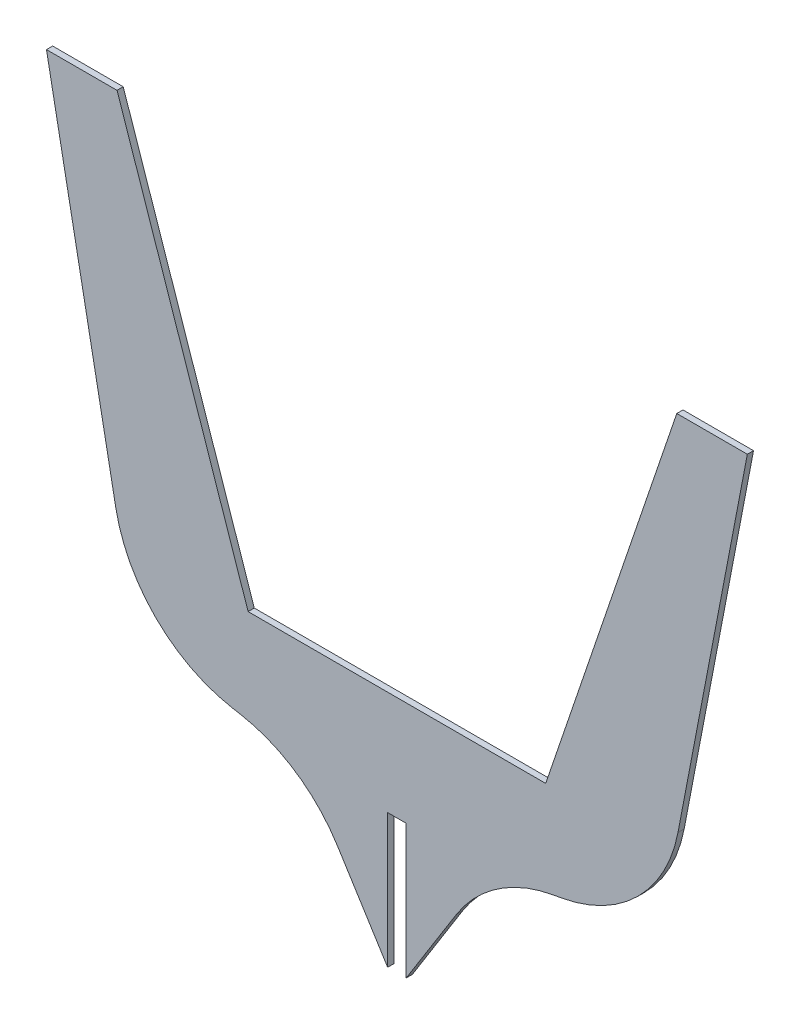
ISO-10303-21;
HEADER;
FILE_DESCRIPTION(('STEP AP214'),'2;1');
FILE_NAME('part.step','',(''),(''),'','','');
FILE_SCHEMA(('AUTOMOTIVE_DESIGN { 1 0 10303 214 1 1 1 1 }'));
ENDSEC;
DATA;
#1=APPLICATION_CONTEXT('core data for automotive mechanical design processes');
#2=APPLICATION_PROTOCOL_DEFINITION('international standard','automotive_design',2000,#1);
#3=PRODUCT_CONTEXT('',#1,'mechanical');
#4=PRODUCT('Part','Part','',(#3));
#5=PRODUCT_RELATED_PRODUCT_CATEGORY('part','',(#4));
#6=PRODUCT_DEFINITION_FORMATION('','',#4);
#7=PRODUCT_DEFINITION_CONTEXT('part definition',#1,'design');
#8=PRODUCT_DEFINITION('design','',#6,#7);
#9=PRODUCT_DEFINITION_SHAPE('','',#8);
#10=(LENGTH_UNIT() NAMED_UNIT(*) SI_UNIT(.MILLI.,.METRE.));
#11=(NAMED_UNIT(*) PLANE_ANGLE_UNIT() SI_UNIT($,.RADIAN.));
#12=(NAMED_UNIT(*) SI_UNIT($,.STERADIAN.) SOLID_ANGLE_UNIT());
#13=UNCERTAINTY_MEASURE_WITH_UNIT(LENGTH_MEASURE(1.E-05),#10,'distance_accuracy_value','');
#14=(GEOMETRIC_REPRESENTATION_CONTEXT(3) GLOBAL_UNCERTAINTY_ASSIGNED_CONTEXT((#13)) GLOBAL_UNIT_ASSIGNED_CONTEXT((#10,
#11,#12)) REPRESENTATION_CONTEXT('',''));
#15=CARTESIAN_POINT('',(0.,0.,0.));
#16=DIRECTION('',(0.,0.,1.));
#17=DIRECTION('',(1.,0.,0.));
#18=AXIS2_PLACEMENT_3D('',#15,#16,#17);
#19=CARTESIAN_POINT('',(-60.7194290074853,223.87379688582,3.));
#20=DIRECTION('',(-0.9468587418631,-0.321649689813976,0.));
#21=DIRECTION('',(0.321649689813976,-0.9468587418631,0.));
#22=AXIS2_PLACEMENT_3D('',#19,#20,#21);
#23=PLANE('',#22);
#24=DIRECTION('',(-0.321649689813976,0.9468587418631,0.));
#25=VECTOR('',#24,1.);
#26=CARTESIAN_POINT('',(-60.7194290074853,223.87379688582,0.));
#27=LINE('',#26,#25);
#28=CARTESIAN_POINT('',(2.8758954370924,36.6645726928973,0.));
#29=VERTEX_POINT('',#28);
#30=CARTESIAN_POINT('',(-60.7194290074853,223.87379688582,0.));
#31=VERTEX_POINT('',#30);
#32=EDGE_CURVE('E184',#29,#31,#27,.T.);
#33=ORIENTED_EDGE('',*,*,#32,.T.);
#34=DIRECTION('',(0.,0.,-1.));
#35=VECTOR('',#34,1.);
#36=CARTESIAN_POINT('',(-60.7194290074853,223.87379688582,3.));
#37=LINE('',#36,#35);
#38=CARTESIAN_POINT('',(-60.7194290074853,223.87379688582,3.));
#39=VERTEX_POINT('',#38);
#40=EDGE_CURVE('E165',#39,#31,#37,.T.);
#41=ORIENTED_EDGE('',*,*,#40,.F.);
#42=DIRECTION('',(-0.321649689813976,0.9468587418631,0.));
#43=VECTOR('',#42,1.);
#44=CARTESIAN_POINT('',(-60.7194290074853,223.87379688582,3.));
#45=LINE('',#44,#43);
#46=CARTESIAN_POINT('',(2.8758954370924,36.6645726928973,3.));
#47=VERTEX_POINT('',#46);
#48=EDGE_CURVE('E172',#47,#39,#45,.T.);
#49=ORIENTED_EDGE('',*,*,#48,.F.);
#50=DIRECTION('',(0.,0.,-1.));
#51=VECTOR('',#50,1.);
#52=CARTESIAN_POINT('',(2.8758954370924,36.6645726928973,3.));
#53=LINE('',#52,#51);
#54=EDGE_CURVE('E256',#47,#29,#53,.T.);
#55=ORIENTED_EDGE('',*,*,#54,.T.);
#56=EDGE_LOOP('',(#33,#41,#49,#55));
#57=FACE_BOUND('',#56,.T.);
#58=ADVANCED_FACE('F35',(#57),#23,.F.);
#59=CARTESIAN_POINT('',(-60.7194290074853,223.87379688582,3.));
#60=DIRECTION('',(0.,-1.,0.));
#61=DIRECTION('',(0.,0.,-1.));
#62=AXIS2_PLACEMENT_3D('',#59,#60,#61);
#63=PLANE('',#62);
#64=DIRECTION('',(-1.,0.,0.));
#65=VECTOR('',#64,1.);
#66=CARTESIAN_POINT('',(-60.7194290074853,223.87379688582,0.));
#67=LINE('',#66,#65);
#68=CARTESIAN_POINT('',(-94.9471708127322,223.87379688582,0.));
#69=VERTEX_POINT('',#68);
#70=EDGE_CURVE('E258',#31,#69,#67,.T.);
#71=ORIENTED_EDGE('',*,*,#70,.T.);
#72=DIRECTION('',(0.,0.,-1.));
#73=VECTOR('',#72,1.);
#74=CARTESIAN_POINT('',(-94.9471708127322,223.87379688582,3.));
#75=LINE('',#74,#73);
#76=CARTESIAN_POINT('',(-94.9471708127322,223.87379688582,3.));
#77=VERTEX_POINT('',#76);
#78=EDGE_CURVE('E168',#77,#69,#75,.T.);
#79=ORIENTED_EDGE('',*,*,#78,.F.);
#80=DIRECTION('',(-1.,0.,0.));
#81=VECTOR('',#80,1.);
#82=CARTESIAN_POINT('',(-60.7194290074853,223.87379688582,3.));
#83=LINE('',#82,#81);
#84=EDGE_CURVE('E161',#39,#77,#83,.T.);
#85=ORIENTED_EDGE('',*,*,#84,.F.);
#86=ORIENTED_EDGE('',*,*,#40,.T.);
#87=EDGE_LOOP('',(#71,#79,#85,#86));
#88=FACE_BOUND('',#87,.T.);
#89=ADVANCED_FACE('F163',(#88),#63,.F.);
#90=CARTESIAN_POINT('',(-94.9471708127322,223.87379688582,3.));
#91=DIRECTION('',(0.982161493286106,0.188039360523285,0.));
#92=DIRECTION('',(-0.188039360523285,0.982161493286106,0.));
#93=AXIS2_PLACEMENT_3D('',#90,#91,#92);
#94=PLANE('',#93);
#95=DIRECTION('',(0.188039360523285,-0.982161493286106,0.));
#96=VECTOR('',#95,1.);
#97=CARTESIAN_POINT('',(-94.9471708127322,223.87379688582,0.));
#98=LINE('',#97,#96);
#99=CARTESIAN_POINT('',(-61.2998496903465,48.1281281775532,0.));
#100=VERTEX_POINT('',#99);
#101=EDGE_CURVE('E260',#69,#100,#98,.T.);
#102=ORIENTED_EDGE('',*,*,#101,.T.);
#103=DIRECTION('',(0.,0.,-1.));
#104=VECTOR('',#103,1.);
#105=CARTESIAN_POINT('',(-61.2998496903465,48.1281281775532,3.));
#106=LINE('',#105,#104);
#107=CARTESIAN_POINT('',(-61.2998496903465,48.1281281775532,3.));
#108=VERTEX_POINT('',#107);
#109=EDGE_CURVE('E202',#100,#108,#106,.F.);
#110=ORIENTED_EDGE('',*,*,#109,.T.);
#111=DIRECTION('',(0.188039360523285,-0.982161493286106,0.));
#112=VECTOR('',#111,1.);
#113=CARTESIAN_POINT('',(-94.9471708127322,223.87379688582,3.));
#114=LINE('',#113,#112);
#115=EDGE_CURVE('E171',#77,#108,#114,.T.);
#116=ORIENTED_EDGE('',*,*,#115,.F.);
#117=ORIENTED_EDGE('',*,*,#78,.T.);
#118=EDGE_LOOP('',(#102,#110,#116,#117));
#119=FACE_BOUND('',#118,.T.);
#120=ADVANCED_FACE('F348',(#119),#94,.F.);
#121=CARTESIAN_POINT('',(-52.2777216144433,1.00402203834812,3.));
#122=DIRECTION('',(0.178903713021598,0.983866587229735,0.));
#123=DIRECTION('',(-0.983866587229735,0.178903713021598,0.));
#124=AXIS2_PLACEMENT_3D('',#121,#122,#123);
#125=PLANE('',#124);
#126=DIRECTION('',(0.983866587229735,-0.178903713021598,0.));
#127=VECTOR('',#126,1.);
#128=CARTESIAN_POINT('',(-52.2777216144433,1.00402203834812,0.));
#129=LINE('',#128,#127);
#130=CARTESIAN_POINT('',(-5.07180507183095,-7.57977769189828,0.));
#131=VERTEX_POINT('',#130);
#132=CARTESIAN_POINT('',(-0.564859123719376,-8.39930889152477,0.));
#133=VERTEX_POINT('',#132);
#134=EDGE_CURVE('E263',#131,#133,#129,.T.);
#135=ORIENTED_EDGE('',*,*,#134,.T.);
#136=DIRECTION('',(0.,0.,-1.));
#137=VECTOR('',#136,1.);
#138=CARTESIAN_POINT('',(-0.564859123719354,-8.39930889152478,3.));
#139=LINE('',#138,#137);
#140=CARTESIAN_POINT('',(-0.564859123719376,-8.39930889152477,3.));
#141=VERTEX_POINT('',#140);
#142=EDGE_CURVE('E196',#133,#141,#139,.F.);
#143=ORIENTED_EDGE('',*,*,#142,.T.);
#144=DIRECTION('',(0.983866587229735,-0.178903713021598,0.));
#145=VECTOR('',#144,1.);
#146=CARTESIAN_POINT('',(-52.2777216144433,1.00402203834812,3.));
#147=LINE('',#146,#145);
#148=CARTESIAN_POINT('',(-5.07180507183095,-7.57977769189828,3.));
#149=VERTEX_POINT('',#148);
#150=EDGE_CURVE('E322',#149,#141,#147,.T.);
#151=ORIENTED_EDGE('',*,*,#150,.F.);
#152=DIRECTION('',(0.,0.,-1.));
#153=VECTOR('',#152,1.);
#154=CARTESIAN_POINT('',(-5.07180507183092,-7.57977769189828,3.));
#155=LINE('',#154,#153);
#156=EDGE_CURVE('E188',#149,#131,#155,.T.);
#157=ORIENTED_EDGE('',*,*,#156,.T.);
#158=EDGE_LOOP('',(#135,#143,#151,#157));
#159=FACE_BOUND('',#158,.T.);
#160=ADVANCED_FACE('F333',(#159),#125,.F.);
#161=CARTESIAN_POINT('',(29.8298513324426,-13.9262031141802,3.));
#162=DIRECTION('',(0.847423709661977,0.530917184034133,0.));
#163=DIRECTION('',(-0.530917184034133,0.847423709661977,0.));
#164=AXIS2_PLACEMENT_3D('',#161,#162,#163);
#165=PLANE('',#164);
#166=DIRECTION('',(0.530917184034133,-0.847423709661977,0.));
#167=VECTOR('',#166,1.);
#168=CARTESIAN_POINT('',(29.8298513324426,-13.9262031141802,3.));
#169=LINE('',#168,#167);
#170=CARTESIAN_POINT('',(46.2315406411072,-40.1057671152169,3.));
#171=VERTEX_POINT('',#170);
#172=CARTESIAN_POINT('',(70.5528291872678,-78.9262031141802,3.));
#173=VERTEX_POINT('',#172);
#174=EDGE_CURVE('E320',#171,#173,#169,.T.);
#175=ORIENTED_EDGE('',*,*,#174,.F.);
#176=DIRECTION('',(0.,0.,-1.));
#177=VECTOR('',#176,1.);
#178=CARTESIAN_POINT('',(46.2315406411072,-40.1057671152169,0.));
#179=LINE('',#178,#177);
#180=CARTESIAN_POINT('',(46.2315406411072,-40.1057671152169,0.));
#181=VERTEX_POINT('',#180);
#182=EDGE_CURVE('E185',#171,#181,#179,.T.);
#183=ORIENTED_EDGE('',*,*,#182,.T.);
#184=DIRECTION('',(0.530917184034133,-0.847423709661977,0.));
#185=VECTOR('',#184,1.);
#186=CARTESIAN_POINT('',(29.8298513324426,-13.9262031141802,0.));
#187=LINE('',#186,#185);
#188=CARTESIAN_POINT('',(70.5528291872678,-78.9262031141802,0.));
#189=VERTEX_POINT('',#188);
#190=EDGE_CURVE('E266',#181,#189,#187,.T.);
#191=ORIENTED_EDGE('',*,*,#190,.T.);
#192=DIRECTION('',(0.,0.,-1.));
#193=VECTOR('',#192,1.);
#194=CARTESIAN_POINT('',(70.5528291872678,-78.9262031141802,3.));
#195=LINE('',#194,#193);
#196=EDGE_CURVE('E190',#173,#189,#195,.T.);
#197=ORIENTED_EDGE('',*,*,#196,.F.);
#198=EDGE_LOOP('',(#175,#183,#191,#197));
#199=FACE_BOUND('',#198,.T.);
#200=ADVANCED_FACE('F340',(#199),#165,.F.);
#201=CARTESIAN_POINT('',(70.5528291872678,-78.9262031141802,3.));
#202=DIRECTION('',(-1.,0.,0.));
#203=DIRECTION('',(0.,-1.,0.));
#204=AXIS2_PLACEMENT_3D('',#201,#202,#203);
#205=PLANE('',#204);
#206=DIRECTION('',(0.,1.,0.));
#207=VECTOR('',#206,1.);
#208=CARTESIAN_POINT('',(70.5528291872678,-78.9262031141802,0.));
#209=LINE('',#208,#207);
#210=CARTESIAN_POINT('',(70.5528291872678,-13.9262031141802,0.));
#211=VERTEX_POINT('',#210);
#212=EDGE_CURVE('E268',#189,#211,#209,.T.);
#213=ORIENTED_EDGE('',*,*,#212,.T.);
#214=DIRECTION('',(0.,0.,-1.));
#215=VECTOR('',#214,1.);
#216=CARTESIAN_POINT('',(70.5528291872678,-13.9262031141802,3.));
#217=LINE('',#216,#215);
#218=CARTESIAN_POINT('',(70.5528291872678,-13.9262031141802,3.));
#219=VERTEX_POINT('',#218);
#220=EDGE_CURVE('E295',#219,#211,#217,.T.);
#221=ORIENTED_EDGE('',*,*,#220,.F.);
#222=DIRECTION('',(0.,1.,0.));
#223=VECTOR('',#222,1.);
#224=CARTESIAN_POINT('',(70.5528291872678,-78.9262031141802,3.));
#225=LINE('',#224,#223);
#226=EDGE_CURVE('E304',#173,#219,#225,.T.);
#227=ORIENTED_EDGE('',*,*,#226,.F.);
#228=ORIENTED_EDGE('',*,*,#196,.T.);
#229=EDGE_LOOP('',(#213,#221,#227,#228));
#230=FACE_BOUND('',#229,.T.);
#231=ADVANCED_FACE('F302',(#230),#205,.F.);
#232=CARTESIAN_POINT('',(79.5528291872678,-13.9262031141802,3.));
#233=DIRECTION('',(0.,1.,0.));
#234=DIRECTION('',(-1.,0.,0.));
#235=AXIS2_PLACEMENT_3D('',#232,#233,#234);
#236=PLANE('',#235);
#237=DIRECTION('',(1.,0.,0.));
#238=VECTOR('',#237,1.);
#239=CARTESIAN_POINT('',(79.5528291872678,-13.9262031141802,0.));
#240=LINE('',#239,#238);
#241=CARTESIAN_POINT('',(79.5528291872678,-13.9262031141802,0.));
#242=VERTEX_POINT('',#241);
#243=EDGE_CURVE('E270',#211,#242,#240,.T.);
#244=ORIENTED_EDGE('',*,*,#243,.T.);
#245=DIRECTION('',(0.,0.,-1.));
#246=VECTOR('',#245,1.);
#247=CARTESIAN_POINT('',(79.5528291872678,-13.9262031141802,3.));
#248=LINE('',#247,#246);
#249=CARTESIAN_POINT('',(79.5528291872678,-13.9262031141802,3.));
#250=VERTEX_POINT('',#249);
#251=EDGE_CURVE('E292',#250,#242,#248,.T.);
#252=ORIENTED_EDGE('',*,*,#251,.F.);
#253=DIRECTION('',(1.,0.,0.));
#254=VECTOR('',#253,1.);
#255=CARTESIAN_POINT('',(79.5528291872678,-13.9262031141802,3.));
#256=LINE('',#255,#254);
#257=EDGE_CURVE('E316',#219,#250,#256,.T.);
#258=ORIENTED_EDGE('',*,*,#257,.F.);
#259=ORIENTED_EDGE('',*,*,#220,.T.);
#260=EDGE_LOOP('',(#244,#252,#258,#259));
#261=FACE_BOUND('',#260,.T.);
#262=ADVANCED_FACE('F311',(#261),#236,.F.);
#263=CARTESIAN_POINT('',(79.5528291872679,-78.9262031141802,3.));
#264=DIRECTION('',(1.,0.,0.));
#265=DIRECTION('',(0.,1.,0.));
#266=AXIS2_PLACEMENT_3D('',#263,#264,#265);
#267=PLANE('',#266);
#268=DIRECTION('',(0.,-1.,0.));
#269=VECTOR('',#268,1.);
#270=CARTESIAN_POINT('',(79.5528291872679,-78.9262031141802,0.));
#271=LINE('',#270,#269);
#272=CARTESIAN_POINT('',(79.5528291872679,-78.9262031141802,0.));
#273=VERTEX_POINT('',#272);
#274=EDGE_CURVE('E238',#242,#273,#271,.T.);
#275=ORIENTED_EDGE('',*,*,#274,.T.);
#276=DIRECTION('',(0.,0.,-1.));
#277=VECTOR('',#276,1.);
#278=CARTESIAN_POINT('',(79.5528291872679,-78.9262031141802,3.));
#279=LINE('',#278,#277);
#280=CARTESIAN_POINT('',(79.5528291872679,-78.9262031141802,3.));
#281=VERTEX_POINT('',#280);
#282=EDGE_CURVE('E237',#281,#273,#279,.T.);
#283=ORIENTED_EDGE('',*,*,#282,.F.);
#284=DIRECTION('',(0.,-1.,0.));
#285=VECTOR('',#284,1.);
#286=CARTESIAN_POINT('',(79.5528291872679,-78.9262031141802,3.));
#287=LINE('',#286,#285);
#288=EDGE_CURVE('E248',#250,#281,#287,.T.);
#289=ORIENTED_EDGE('',*,*,#288,.F.);
#290=ORIENTED_EDGE('',*,*,#251,.T.);
#291=EDGE_LOOP('',(#275,#283,#289,#290));
#292=FACE_BOUND('',#291,.T.);
#293=ADVANCED_FACE('F315',(#292),#267,.F.);
#294=CARTESIAN_POINT('',(120.275807042093,-13.9262031141802,3.));
#295=DIRECTION('',(-0.847423709661977,0.530917184034132,0.));
#296=DIRECTION('',(-0.530917184034132,-0.847423709661977,0.));
#297=AXIS2_PLACEMENT_3D('',#294,#295,#296);
#298=PLANE('',#297);
#299=DIRECTION('',(0.530917184034132,0.847423709661977,0.));
#300=VECTOR('',#299,1.);
#301=CARTESIAN_POINT('',(120.275807042093,-13.9262031141802,0.));
#302=LINE('',#301,#300);
#303=CARTESIAN_POINT('',(103.874117733429,-40.1057671152169,0.));
#304=VERTEX_POINT('',#303);
#305=EDGE_CURVE('E226',#273,#304,#302,.T.);
#306=ORIENTED_EDGE('',*,*,#305,.T.);
#307=DIRECTION('',(0.,0.,-1.));
#308=VECTOR('',#307,1.);
#309=CARTESIAN_POINT('',(103.874117733429,-40.1057671152169,3.));
#310=LINE('',#309,#308);
#311=CARTESIAN_POINT('',(103.874117733429,-40.1057671152169,3.));
#312=VERTEX_POINT('',#311);
#313=EDGE_CURVE('E214',#304,#312,#310,.F.);
#314=ORIENTED_EDGE('',*,*,#313,.T.);
#315=DIRECTION('',(0.530917184034132,0.847423709661977,0.));
#316=VECTOR('',#315,1.);
#317=CARTESIAN_POINT('',(120.275807042093,-13.9262031141802,3.));
#318=LINE('',#317,#316);
#319=EDGE_CURVE('E242',#281,#312,#318,.T.);
#320=ORIENTED_EDGE('',*,*,#319,.F.);
#321=ORIENTED_EDGE('',*,*,#282,.T.);
#322=EDGE_LOOP('',(#306,#314,#320,#321));
#323=FACE_BOUND('',#322,.T.);
#324=ADVANCED_FACE('F233',(#323),#298,.F.);
#325=CARTESIAN_POINT('',(202.383379988979,1.00402203834818,3.));
#326=DIRECTION('',(-0.178903713021599,0.983866587229735,0.));
#327=DIRECTION('',(-0.983866587229735,-0.178903713021599,0.));
#328=AXIS2_PLACEMENT_3D('',#325,#326,#327);
#329=PLANE('',#328);
#330=DIRECTION('',(0.983866587229735,0.178903713021599,0.));
#331=VECTOR('',#330,1.);
#332=CARTESIAN_POINT('',(202.383379988979,1.00402203834818,0.));
#333=LINE('',#332,#331);
#334=CARTESIAN_POINT('',(150.670517498255,-8.39930889152475,0.));
#335=VERTEX_POINT('',#334);
#336=CARTESIAN_POINT('',(155.177463446367,-7.57977769189825,0.));
#337=VERTEX_POINT('',#336);
#338=EDGE_CURVE('E227',#335,#337,#333,.T.);
#339=ORIENTED_EDGE('',*,*,#338,.T.);
#340=DIRECTION('',(0.,0.,-1.));
#341=VECTOR('',#340,1.);
#342=CARTESIAN_POINT('',(155.177463446367,-7.57977769189825,3.));
#343=LINE('',#342,#341);
#344=CARTESIAN_POINT('',(155.177463446367,-7.57977769189825,3.));
#345=VERTEX_POINT('',#344);
#346=EDGE_CURVE('E58',#337,#345,#343,.F.);
#347=ORIENTED_EDGE('',*,*,#346,.T.);
#348=DIRECTION('',(0.983866587229735,0.178903713021599,0.));
#349=VECTOR('',#348,1.);
#350=CARTESIAN_POINT('',(202.383379988979,1.00402203834818,3.));
#351=LINE('',#350,#349);
#352=CARTESIAN_POINT('',(150.670517498255,-8.39930889152475,3.));
#353=VERTEX_POINT('',#352);
#354=EDGE_CURVE('E241',#353,#345,#351,.T.);
#355=ORIENTED_EDGE('',*,*,#354,.F.);
#356=DIRECTION('',(0.,0.,-1.));
#357=VECTOR('',#356,1.);
#358=CARTESIAN_POINT('',(150.670517498255,-8.39930889152476,0.));
#359=LINE('',#358,#357);
#360=EDGE_CURVE('E210',#353,#335,#359,.T.);
#361=ORIENTED_EDGE('',*,*,#360,.T.);
#362=EDGE_LOOP('',(#339,#347,#355,#361));
#363=FACE_BOUND('',#362,.T.);
#364=ADVANCED_FACE('F243',(#363),#329,.F.);
#365=CARTESIAN_POINT('',(245.052829187268,223.87379688582,3.));
#366=DIRECTION('',(-0.982161493286106,0.188039360523284,0.));
#367=DIRECTION('',(-0.188039360523284,-0.982161493286106,0.));
#368=AXIS2_PLACEMENT_3D('',#365,#366,#367);
#369=PLANE('',#368);
#370=DIRECTION('',(0.188039360523284,0.982161493286106,0.));
#371=VECTOR('',#370,1.);
#372=CARTESIAN_POINT('',(245.052829187268,223.87379688582,3.));
#373=LINE('',#372,#371);
#374=CARTESIAN_POINT('',(211.405508064882,48.1281281775533,3.));
#375=VERTEX_POINT('',#374);
#376=CARTESIAN_POINT('',(245.052829187268,223.87379688582,3.));
#377=VERTEX_POINT('',#376);
#378=EDGE_CURVE('E244',#375,#377,#373,.T.);
#379=ORIENTED_EDGE('',*,*,#378,.F.);
#380=DIRECTION('',(0.,0.,-1.));
#381=VECTOR('',#380,1.);
#382=CARTESIAN_POINT('',(211.405508064882,48.1281281775533,3.));
#383=LINE('',#382,#381);
#384=CARTESIAN_POINT('',(211.405508064882,48.1281281775533,0.));
#385=VERTEX_POINT('',#384);
#386=EDGE_CURVE('E207',#375,#385,#383,.T.);
#387=ORIENTED_EDGE('',*,*,#386,.T.);
#388=DIRECTION('',(0.188039360523284,0.982161493286106,0.));
#389=VECTOR('',#388,1.);
#390=CARTESIAN_POINT('',(245.052829187268,223.87379688582,0.));
#391=LINE('',#390,#389);
#392=CARTESIAN_POINT('',(245.052829187268,223.87379688582,0.));
#393=VERTEX_POINT('',#392);
#394=EDGE_CURVE('E274',#385,#393,#391,.T.);
#395=ORIENTED_EDGE('',*,*,#394,.T.);
#396=DIRECTION('',(0.,0.,-1.));
#397=VECTOR('',#396,1.);
#398=CARTESIAN_POINT('',(245.052829187268,223.87379688582,3.));
#399=LINE('',#398,#397);
#400=EDGE_CURVE('E288',#377,#393,#399,.T.);
#401=ORIENTED_EDGE('',*,*,#400,.F.);
#402=EDGE_LOOP('',(#379,#387,#395,#401));
#403=FACE_BOUND('',#402,.T.);
#404=ADVANCED_FACE('F370',(#403),#369,.F.);
#405=CARTESIAN_POINT('',(210.825087382021,223.87379688582,3.));
#406=DIRECTION('',(0.,-1.,0.));
#407=DIRECTION('',(0.,0.,-1.));
#408=AXIS2_PLACEMENT_3D('',#405,#406,#407);
#409=PLANE('',#408);
#410=DIRECTION('',(-1.,0.,0.));
#411=VECTOR('',#410,1.);
#412=CARTESIAN_POINT('',(210.825087382021,223.87379688582,0.));
#413=LINE('',#412,#411);
#414=CARTESIAN_POINT('',(210.825087382021,223.87379688582,0.));
#415=VERTEX_POINT('',#414);
#416=EDGE_CURVE('E276',#393,#415,#413,.T.);
#417=ORIENTED_EDGE('',*,*,#416,.T.);
#418=DIRECTION('',(0.,0.,-1.));
#419=VECTOR('',#418,1.);
#420=CARTESIAN_POINT('',(210.825087382021,223.87379688582,3.));
#421=LINE('',#420,#419);
#422=CARTESIAN_POINT('',(210.825087382021,223.87379688582,3.));
#423=VERTEX_POINT('',#422);
#424=EDGE_CURVE('E285',#423,#415,#421,.T.);
#425=ORIENTED_EDGE('',*,*,#424,.F.);
#426=DIRECTION('',(-1.,0.,0.));
#427=VECTOR('',#426,1.);
#428=CARTESIAN_POINT('',(210.825087382021,223.87379688582,3.));
#429=LINE('',#428,#427);
#430=EDGE_CURVE('E246',#377,#423,#429,.T.);
#431=ORIENTED_EDGE('',*,*,#430,.F.);
#432=ORIENTED_EDGE('',*,*,#400,.T.);
#433=EDGE_LOOP('',(#417,#425,#431,#432));
#434=FACE_BOUND('',#433,.T.);
#435=ADVANCED_FACE('F377',(#434),#409,.F.);
#436=CARTESIAN_POINT('',(210.825087382021,223.87379688582,3.));
#437=DIRECTION('',(0.9468587418631,-0.321649689813975,0.));
#438=DIRECTION('',(0.321649689813975,0.9468587418631,0.));
#439=AXIS2_PLACEMENT_3D('',#436,#437,#438);
#440=PLANE('',#439);
#441=DIRECTION('',(-0.321649689813975,-0.9468587418631,0.));
#442=VECTOR('',#441,1.);
#443=CARTESIAN_POINT('',(210.825087382021,223.87379688582,0.));
#444=LINE('',#443,#442);
#445=CARTESIAN_POINT('',(147.229762937443,36.6645726928973,0.));
#446=VERTEX_POINT('',#445);
#447=EDGE_CURVE('E278',#415,#446,#444,.T.);
#448=ORIENTED_EDGE('',*,*,#447,.T.);
#449=DIRECTION('',(0.,0.,-1.));
#450=VECTOR('',#449,1.);
#451=CARTESIAN_POINT('',(147.229762937443,36.6645726928973,3.));
#452=LINE('',#451,#450);
#453=CARTESIAN_POINT('',(147.229762937443,36.6645726928973,3.));
#454=VERTEX_POINT('',#453);
#455=EDGE_CURVE('E282',#454,#446,#452,.T.);
#456=ORIENTED_EDGE('',*,*,#455,.F.);
#457=DIRECTION('',(-0.321649689813975,-0.9468587418631,0.));
#458=VECTOR('',#457,1.);
#459=CARTESIAN_POINT('',(210.825087382021,223.87379688582,3.));
#460=LINE('',#459,#458);
#461=EDGE_CURVE('E253',#423,#454,#460,.T.);
#462=ORIENTED_EDGE('',*,*,#461,.F.);
#463=ORIENTED_EDGE('',*,*,#424,.T.);
#464=EDGE_LOOP('',(#448,#456,#462,#463));
#465=FACE_BOUND('',#464,.T.);
#466=ADVANCED_FACE('F381',(#465),#440,.F.);
#467=CARTESIAN_POINT('',(147.229762937443,36.6645726928973,3.));
#468=DIRECTION('',(0.,-1.,0.));
#469=DIRECTION('',(1.,0.,0.));
#470=AXIS2_PLACEMENT_3D('',#467,#468,#469);
#471=PLANE('',#470);
#472=DIRECTION('',(-1.,0.,0.));
#473=VECTOR('',#472,1.);
#474=CARTESIAN_POINT('',(147.229762937443,36.6645726928973,0.));
#475=LINE('',#474,#473);
#476=EDGE_CURVE('E181',#446,#29,#475,.T.);
#477=ORIENTED_EDGE('',*,*,#476,.T.);
#478=ORIENTED_EDGE('',*,*,#54,.F.);
#479=DIRECTION('',(-1.,0.,0.));
#480=VECTOR('',#479,1.);
#481=CARTESIAN_POINT('',(147.229762937443,36.6645726928973,3.));
#482=LINE('',#481,#480);
#483=EDGE_CURVE('E177',#454,#47,#482,.T.);
#484=ORIENTED_EDGE('',*,*,#483,.F.);
#485=ORIENTED_EDGE('',*,*,#455,.T.);
#486=EDGE_LOOP('',(#477,#478,#484,#485));
#487=FACE_BOUND('',#486,.T.);
#488=ADVANCED_FACE('F384',(#487),#471,.F.);
#489=CARTESIAN_POINT('',(0.,0.,3.));
#490=DIRECTION('',(0.,0.,-1.));
#491=DIRECTION('',(-1.,0.,0.));
#492=AXIS2_PLACEMENT_3D('',#489,#490,#491);
#493=PLANE('',#492);
#494=ORIENTED_EDGE('',*,*,#115,.T.);
#495=CARTESIAN_POINT('',(7.45145483968096,61.2908834141832,3.));
#496=DIRECTION('',(0.,0.,-1.));
#497=DIRECTION('',(-1.,0.,0.));
#498=AXIS2_PLACEMENT_3D('',#495,#496,#497);
#499=CIRCLE('',#498,70.);
#500=EDGE_CURVE('E205',#108,#149,#499,.F.);
#501=ORIENTED_EDGE('',*,*,#500,.T.);
#502=ORIENTED_EDGE('',*,*,#150,.T.);
#503=CARTESIAN_POINT('',(-13.0881190352312,-77.2699699976062,3.));
#504=DIRECTION('',(0.,0.,-1.));
#505=DIRECTION('',(-1.,0.,0.));
#506=AXIS2_PLACEMENT_3D('',#503,#504,#505);
#507=CIRCLE('',#506,70.);
#508=EDGE_CURVE('E218',#141,#171,#507,.T.);
#509=ORIENTED_EDGE('',*,*,#508,.T.);
#510=ORIENTED_EDGE('',*,*,#174,.T.);
#511=ORIENTED_EDGE('',*,*,#226,.T.);
#512=ORIENTED_EDGE('',*,*,#257,.T.);
#513=ORIENTED_EDGE('',*,*,#288,.T.);
#514=ORIENTED_EDGE('',*,*,#319,.T.);
#515=CARTESIAN_POINT('',(163.193777409767,-77.2699699976062,3.));
#516=DIRECTION('',(0.,0.,-1.));
#517=DIRECTION('',(-1.,0.,0.));
#518=AXIS2_PLACEMENT_3D('',#515,#516,#517);
#519=CIRCLE('',#518,70.);
#520=EDGE_CURVE('E11',#312,#353,#519,.T.);
#521=ORIENTED_EDGE('',*,*,#520,.T.);
#522=ORIENTED_EDGE('',*,*,#354,.T.);
#523=CARTESIAN_POINT('',(142.654203534855,61.2908834141832,3.));
#524=DIRECTION('',(0.,0.,-1.));
#525=DIRECTION('',(-1.,0.,0.));
#526=AXIS2_PLACEMENT_3D('',#523,#524,#525);
#527=CIRCLE('',#526,70.);
#528=EDGE_CURVE('E50',#345,#375,#527,.F.);
#529=ORIENTED_EDGE('',*,*,#528,.T.);
#530=ORIENTED_EDGE('',*,*,#378,.T.);
#531=ORIENTED_EDGE('',*,*,#430,.T.);
#532=ORIENTED_EDGE('',*,*,#461,.T.);
#533=ORIENTED_EDGE('',*,*,#483,.T.);
#534=ORIENTED_EDGE('',*,*,#48,.T.);
#535=ORIENTED_EDGE('',*,*,#84,.T.);
#536=EDGE_LOOP('',(#494,#501,#502,#509,#510,#511,#512,#513,#514,#521,#522,#529,#530,#531,#532,
#533,#534,#535));
#537=FACE_BOUND('',#536,.T.);
#538=ADVANCED_FACE('F175',(#537),#493,.F.);
#539=CARTESIAN_POINT('',(0.,0.,0.));
#540=DIRECTION('',(0.,0.,-1.));
#541=DIRECTION('',(-1.,0.,0.));
#542=AXIS2_PLACEMENT_3D('',#539,#540,#541);
#543=PLANE('',#542);
#544=ORIENTED_EDGE('',*,*,#134,.F.);
#545=CARTESIAN_POINT('',(7.45145483968096,61.2908834141832,0.));
#546=DIRECTION('',(0.,0.,-1.));
#547=DIRECTION('',(-1.,0.,0.));
#548=AXIS2_PLACEMENT_3D('',#545,#546,#547);
#549=CIRCLE('',#548,70.);
#550=EDGE_CURVE('E200',#131,#100,#549,.T.);
#551=ORIENTED_EDGE('',*,*,#550,.T.);
#552=ORIENTED_EDGE('',*,*,#101,.F.);
#553=ORIENTED_EDGE('',*,*,#70,.F.);
#554=ORIENTED_EDGE('',*,*,#32,.F.);
#555=ORIENTED_EDGE('',*,*,#476,.F.);
#556=ORIENTED_EDGE('',*,*,#447,.F.);
#557=ORIENTED_EDGE('',*,*,#416,.F.);
#558=ORIENTED_EDGE('',*,*,#394,.F.);
#559=CARTESIAN_POINT('',(142.654203534855,61.2908834141832,0.));
#560=DIRECTION('',(0.,0.,-1.));
#561=DIRECTION('',(-1.,0.,0.));
#562=AXIS2_PLACEMENT_3D('',#559,#560,#561);
#563=CIRCLE('',#562,70.);
#564=EDGE_CURVE('E198',#385,#337,#563,.T.);
#565=ORIENTED_EDGE('',*,*,#564,.T.);
#566=ORIENTED_EDGE('',*,*,#338,.F.);
#567=CARTESIAN_POINT('',(163.193777409767,-77.2699699976062,0.));
#568=DIRECTION('',(0.,0.,-1.));
#569=DIRECTION('',(-1.,0.,0.));
#570=AXIS2_PLACEMENT_3D('',#567,#568,#569);
#571=CIRCLE('',#570,70.);
#572=EDGE_CURVE('E43',#335,#304,#571,.F.);
#573=ORIENTED_EDGE('',*,*,#572,.T.);
#574=ORIENTED_EDGE('',*,*,#305,.F.);
#575=ORIENTED_EDGE('',*,*,#274,.F.);
#576=ORIENTED_EDGE('',*,*,#243,.F.);
#577=ORIENTED_EDGE('',*,*,#212,.F.);
#578=ORIENTED_EDGE('',*,*,#190,.F.);
#579=CARTESIAN_POINT('',(-13.0881190352312,-77.2699699976062,0.));
#580=DIRECTION('',(0.,0.,-1.));
#581=DIRECTION('',(-1.,0.,0.));
#582=AXIS2_PLACEMENT_3D('',#579,#580,#581);
#583=CIRCLE('',#582,70.);
#584=EDGE_CURVE('E216',#181,#133,#583,.F.);
#585=ORIENTED_EDGE('',*,*,#584,.T.);
#586=EDGE_LOOP('',(#544,#551,#552,#553,#554,#555,#556,#557,#558,#565,#566,#573,#574,#575,#576,
#577,#578,#585));
#587=FACE_BOUND('',#586,.T.);
#588=ADVANCED_FACE('F224',(#587),#543,.T.);
#589=CARTESIAN_POINT('',(-13.0881190352312,-77.2699699976062,3.));
#590=DIRECTION('',(0.,0.,1.));
#591=DIRECTION('',(1.,0.,0.));
#592=AXIS2_PLACEMENT_3D('',#589,#590,#591);
#593=CYLINDRICAL_SURFACE('',#592,70.);
#594=ORIENTED_EDGE('',*,*,#508,.F.);
#595=ORIENTED_EDGE('',*,*,#142,.F.);
#596=ORIENTED_EDGE('',*,*,#584,.F.);
#597=ORIENTED_EDGE('',*,*,#182,.F.);
#598=EDGE_LOOP('',(#594,#595,#596,#597));
#599=FACE_BOUND('',#598,.T.);
#600=ADVANCED_FACE('F339',(#599),#593,.F.);
#601=CARTESIAN_POINT('',(7.45145483968096,61.2908834141832,3.));
#602=DIRECTION('',(0.,0.,-1.));
#603=DIRECTION('',(-1.,0.,0.));
#604=AXIS2_PLACEMENT_3D('',#601,#602,#603);
#605=CYLINDRICAL_SURFACE('',#604,70.);
#606=ORIENTED_EDGE('',*,*,#500,.F.);
#607=ORIENTED_EDGE('',*,*,#109,.F.);
#608=ORIENTED_EDGE('',*,*,#550,.F.);
#609=ORIENTED_EDGE('',*,*,#156,.F.);
#610=EDGE_LOOP('',(#606,#607,#608,#609));
#611=FACE_BOUND('',#610,.T.);
#612=ADVANCED_FACE('F331',(#611),#605,.T.);
#613=CARTESIAN_POINT('',(142.654203534855,61.2908834141832,3.));
#614=DIRECTION('',(0.,0.,-1.));
#615=DIRECTION('',(-1.,0.,0.));
#616=AXIS2_PLACEMENT_3D('',#613,#614,#615);
#617=CYLINDRICAL_SURFACE('',#616,70.);
#618=ORIENTED_EDGE('',*,*,#528,.F.);
#619=ORIENTED_EDGE('',*,*,#346,.F.);
#620=ORIENTED_EDGE('',*,*,#564,.F.);
#621=ORIENTED_EDGE('',*,*,#386,.F.);
#622=EDGE_LOOP('',(#618,#619,#620,#621));
#623=FACE_BOUND('',#622,.T.);
#624=ADVANCED_FACE('F361',(#623),#617,.T.);
#625=CARTESIAN_POINT('',(163.193777409767,-77.2699699976062,3.));
#626=DIRECTION('',(0.,0.,1.));
#627=DIRECTION('',(1.,0.,0.));
#628=AXIS2_PLACEMENT_3D('',#625,#626,#627);
#629=CYLINDRICAL_SURFACE('',#628,70.);
#630=ORIENTED_EDGE('',*,*,#520,.F.);
#631=ORIENTED_EDGE('',*,*,#313,.F.);
#632=ORIENTED_EDGE('',*,*,#572,.F.);
#633=ORIENTED_EDGE('',*,*,#360,.F.);
#634=EDGE_LOOP('',(#630,#631,#632,#633));
#635=FACE_BOUND('',#634,.T.);
#636=ADVANCED_FACE('F37',(#635),#629,.F.);
#637=CLOSED_SHELL('',(#58,#89,#120,#160,#200,#231,#262,#293,#324,#364,#404,#435,#466,#488,#538,
#588,#600,#612,#624,#636));
#638=MANIFOLD_SOLID_BREP('B2',#637);
#639=ADVANCED_BREP_SHAPE_REPRESENTATION('',(#18,#638),#14);
#640=SHAPE_DEFINITION_REPRESENTATION(#9,#639);
ENDSEC;
END-ISO-10303-21;
